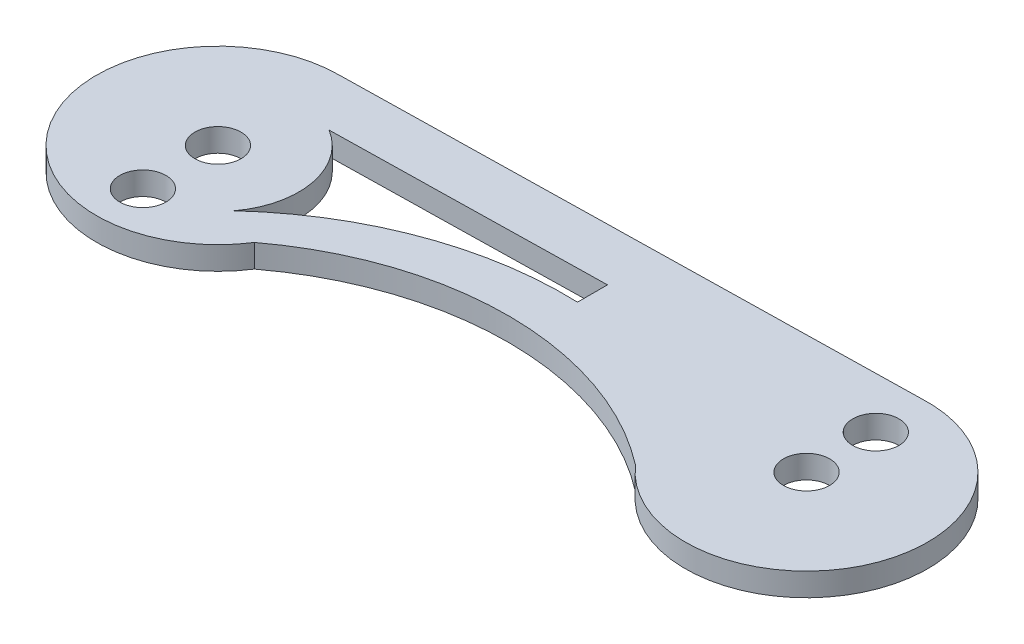
ISO-10303-21;
HEADER;
FILE_DESCRIPTION(('STEP AP214'),'2;1');
FILE_NAME('part.step','',(''),(''),'','','');
FILE_SCHEMA(('AUTOMOTIVE_DESIGN { 1 0 10303 214 1 1 1 1 }'));
ENDSEC;
DATA;
#1=APPLICATION_CONTEXT('core data for automotive mechanical design processes');
#2=APPLICATION_PROTOCOL_DEFINITION('international standard','automotive_design',2000,#1);
#3=PRODUCT_CONTEXT('',#1,'mechanical');
#4=PRODUCT('Part','Part','',(#3));
#5=PRODUCT_RELATED_PRODUCT_CATEGORY('part','',(#4));
#6=PRODUCT_DEFINITION_FORMATION('','',#4);
#7=PRODUCT_DEFINITION_CONTEXT('part definition',#1,'design');
#8=PRODUCT_DEFINITION('design','',#6,#7);
#9=PRODUCT_DEFINITION_SHAPE('','',#8);
#10=(LENGTH_UNIT() NAMED_UNIT(*) SI_UNIT(.MILLI.,.METRE.));
#11=(NAMED_UNIT(*) PLANE_ANGLE_UNIT() SI_UNIT($,.RADIAN.));
#12=(NAMED_UNIT(*) SI_UNIT($,.STERADIAN.) SOLID_ANGLE_UNIT());
#13=UNCERTAINTY_MEASURE_WITH_UNIT(LENGTH_MEASURE(1.E-05),#10,'distance_accuracy_value','');
#14=(GEOMETRIC_REPRESENTATION_CONTEXT(3) GLOBAL_UNCERTAINTY_ASSIGNED_CONTEXT((#13)) GLOBAL_UNIT_ASSIGNED_CONTEXT((#10,
#11,#12)) REPRESENTATION_CONTEXT('',''));
#15=CARTESIAN_POINT('',(0.,0.,0.));
#16=DIRECTION('',(0.,0.,1.));
#17=DIRECTION('',(1.,0.,0.));
#18=AXIS2_PLACEMENT_3D('',#15,#16,#17);
#19=CARTESIAN_POINT('',(-0.192940643459913,2.,-10.1919315878304));
#20=DIRECTION('',(-0.0189273327430687,0.,-0.999820861992404));
#21=DIRECTION('',(-0.999820861992404,0.,0.0189273327430687));
#22=AXIS2_PLACEMENT_3D('',#19,#20,#21);
#23=PLANE('',#22);
#24=DIRECTION('',(0.999820861992404,0.,-0.0189273327430687));
#25=VECTOR('',#24,1.);
#26=CARTESIAN_POINT('',(-0.192940643459913,0.,-10.1919315878304));
#27=LINE('',#26,#25);
#28=CARTESIAN_POINT('',(-33.6615259975206,0.,-9.55834703732032));
#29=VERTEX_POINT('',#28);
#30=CARTESIAN_POINT('',(15.74683894533,0.,-10.4936831551332));
#31=VERTEX_POINT('',#30);
#32=EDGE_CURVE('E150',#29,#31,#27,.T.);
#33=ORIENTED_EDGE('',*,*,#32,.F.);
#34=DIRECTION('',(0.,-1.,0.));
#35=VECTOR('',#34,1.);
#36=CARTESIAN_POINT('',(-33.6615259975206,2.,-9.55834703732032));
#37=LINE('',#36,#35);
#38=CARTESIAN_POINT('',(-33.6615259975206,2.,-9.55834703732032));
#39=VERTEX_POINT('',#38);
#40=EDGE_CURVE('E11',#39,#29,#37,.T.);
#41=ORIENTED_EDGE('',*,*,#40,.F.);
#42=DIRECTION('',(0.999820861992404,0.,-0.0189273327430687));
#43=VECTOR('',#42,1.);
#44=CARTESIAN_POINT('',(-0.192940643459913,2.,-10.1919315878304));
#45=LINE('',#44,#43);
#46=CARTESIAN_POINT('',(15.74683894533,2.,-10.4936831551332));
#47=VERTEX_POINT('',#46);
#48=EDGE_CURVE('E122',#39,#47,#45,.T.);
#49=ORIENTED_EDGE('',*,*,#48,.T.);
#50=DIRECTION('',(0.,-1.,0.));
#51=VECTOR('',#50,1.);
#52=CARTESIAN_POINT('',(15.74683894533,2.,-10.4936831551332));
#53=LINE('',#52,#51);
#54=EDGE_CURVE('E88',#47,#31,#53,.T.);
#55=ORIENTED_EDGE('',*,*,#54,.T.);
#56=EDGE_LOOP('',(#33,#41,#49,#55));
#57=FACE_BOUND('',#56,.T.);
#58=ADVANCED_FACE('F35',(#57),#23,.T.);
#59=CARTESIAN_POINT('',(-33.6615259975206,2.,0.972605925310557));
#60=DIRECTION('',(0.,-1.,0.));
#61=DIRECTION('',(0.,0.,-1.));
#62=AXIS2_PLACEMENT_3D('',#59,#60,#61);
#63=CYLINDRICAL_SURFACE('',#62,10.5309529626309);
#64=CARTESIAN_POINT('',(-33.6615259975206,0.,0.972605925310557));
#65=DIRECTION('',(0.,1.,0.));
#66=DIRECTION('',(0.,0.,1.));
#67=AXIS2_PLACEMENT_3D('',#64,#65,#66);
#68=CIRCLE('',#67,10.5309529626309);
#69=CARTESIAN_POINT('',(-24.804581512259,0.,6.66957921699252));
#70=VERTEX_POINT('',#69);
#71=EDGE_CURVE('E127',#29,#70,#68,.T.);
#72=ORIENTED_EDGE('',*,*,#71,.T.);
#73=DIRECTION('',(0.,-1.,0.));
#74=VECTOR('',#73,1.);
#75=CARTESIAN_POINT('',(-24.804581512259,2.,6.66957921699252));
#76=LINE('',#75,#74);
#77=CARTESIAN_POINT('',(-24.804581512259,2.,6.66957921699252));
#78=VERTEX_POINT('',#77);
#79=EDGE_CURVE('E45',#78,#70,#76,.T.);
#80=ORIENTED_EDGE('',*,*,#79,.F.);
#81=CARTESIAN_POINT('',(-33.6615259975206,2.,0.972605925310557));
#82=DIRECTION('',(0.,1.,0.));
#83=DIRECTION('',(0.,0.,1.));
#84=AXIS2_PLACEMENT_3D('',#81,#82,#83);
#85=CIRCLE('',#84,10.5309529626309);
#86=EDGE_CURVE('E118',#39,#78,#85,.T.);
#87=ORIENTED_EDGE('',*,*,#86,.F.);
#88=ORIENTED_EDGE('',*,*,#40,.T.);
#89=EDGE_LOOP('',(#72,#80,#87,#88));
#90=FACE_BOUND('',#89,.T.);
#91=ADVANCED_FACE('F125',(#90),#63,.T.);
#92=CARTESIAN_POINT('',(-8.33544669817756,2.,28.5449293068003));
#93=DIRECTION('',(0.,-1.,0.));
#94=DIRECTION('',(0.,0.,-1.));
#95=AXIS2_PLACEMENT_3D('',#92,#93,#94);
#96=CYLINDRICAL_SURFACE('',#95,27.3818067898385);
#97=CARTESIAN_POINT('',(-8.33544669817756,0.,28.5449293068003));
#98=DIRECTION('',(0.,1.,0.));
#99=DIRECTION('',(0.,0.,1.));
#100=AXIS2_PLACEMENT_3D('',#97,#98,#99);
#101=CIRCLE('',#100,27.3818067898385);
#102=CARTESIAN_POINT('',(8.39704073387953,0.,6.87035416881678));
#103=VERTEX_POINT('',#102);
#104=EDGE_CURVE('E147',#70,#103,#101,.F.);
#105=ORIENTED_EDGE('',*,*,#104,.T.);
#106=DIRECTION('',(0.,-1.,0.));
#107=VECTOR('',#106,1.);
#108=CARTESIAN_POINT('',(8.39704073387953,2.,6.87035416881678));
#109=LINE('',#108,#107);
#110=CARTESIAN_POINT('',(8.39704073387953,2.,6.87035416881678));
#111=VERTEX_POINT('',#110);
#112=EDGE_CURVE('E117',#111,#103,#109,.T.);
#113=ORIENTED_EDGE('',*,*,#112,.F.);
#114=CARTESIAN_POINT('',(-8.33544669817756,2.,28.5449293068003));
#115=DIRECTION('',(0.,1.,0.));
#116=DIRECTION('',(0.,0.,1.));
#117=AXIS2_PLACEMENT_3D('',#114,#115,#116);
#118=CIRCLE('',#117,27.3818067898385);
#119=EDGE_CURVE('E111',#78,#111,#118,.F.);
#120=ORIENTED_EDGE('',*,*,#119,.F.);
#121=ORIENTED_EDGE('',*,*,#79,.T.);
#122=EDGE_LOOP('',(#105,#113,#120,#121));
#123=FACE_BOUND('',#122,.T.);
#124=ADVANCED_FACE('F114',(#123),#96,.F.);
#125=CARTESIAN_POINT('',(-7.4528444847596,2.,27.580703128786));
#126=DIRECTION('',(0.,-1.,0.));
#127=DIRECTION('',(0.,0.,-1.));
#128=AXIS2_PLACEMENT_3D('',#125,#126,#127);
#129=CYLINDRICAL_SURFACE('',#128,30.4422558900555);
#130=CARTESIAN_POINT('',(-7.4528444847596,0.,27.580703128786));
#131=DIRECTION('',(0.,1.,0.));
#132=DIRECTION('',(0.,0.,1.));
#133=AXIS2_PLACEMENT_3D('',#130,#131,#132);
#134=CIRCLE('',#133,30.4422558900555);
#135=CARTESIAN_POINT('',(-28.0674734680496,0.,5.18052421081929));
#136=VERTEX_POINT('',#135);
#137=CARTESIAN_POINT('',(-6.33735393308298,0.,-2.84110852839083));
#138=VERTEX_POINT('',#137);
#139=EDGE_CURVE('E159',#136,#138,#134,.F.);
#140=ORIENTED_EDGE('',*,*,#139,.F.);
#141=DIRECTION('',(0.,-1.,0.));
#142=VECTOR('',#141,1.);
#143=CARTESIAN_POINT('',(-28.0674734680496,2.,5.18052421081929));
#144=LINE('',#143,#142);
#145=CARTESIAN_POINT('',(-28.0674734680496,2.,5.18052421081929));
#146=VERTEX_POINT('',#145);
#147=EDGE_CURVE('E39',#146,#136,#144,.T.);
#148=ORIENTED_EDGE('',*,*,#147,.F.);
#149=CARTESIAN_POINT('',(-7.4528444847596,2.,27.580703128786));
#150=DIRECTION('',(0.,1.,0.));
#151=DIRECTION('',(0.,0.,1.));
#152=AXIS2_PLACEMENT_3D('',#149,#150,#151);
#153=CIRCLE('',#152,30.4422558900555);
#154=CARTESIAN_POINT('',(-6.33735393308298,2.,-2.84110852839083));
#155=VERTEX_POINT('',#154);
#156=EDGE_CURVE('E184',#146,#155,#153,.F.);
#157=ORIENTED_EDGE('',*,*,#156,.T.);
#158=DIRECTION('',(0.,-1.,0.));
#159=VECTOR('',#158,1.);
#160=CARTESIAN_POINT('',(-6.33735393308298,2.,-2.84110852839083));
#161=LINE('',#160,#159);
#162=EDGE_CURVE('E132',#155,#138,#161,.T.);
#163=ORIENTED_EDGE('',*,*,#162,.T.);
#164=EDGE_LOOP('',(#140,#148,#157,#163));
#165=FACE_BOUND('',#164,.T.);
#166=ADVANCED_FACE('F213',(#165),#129,.T.);
#167=CARTESIAN_POINT('',(-33.6615259975206,2.,0.972605925310557));
#168=DIRECTION('',(0.,-1.,0.));
#169=DIRECTION('',(0.,0.,-1.));
#170=AXIS2_PLACEMENT_3D('',#167,#168,#169);
#171=CYLINDRICAL_SURFACE('',#170,7.);
#172=CARTESIAN_POINT('',(-33.6615259975206,0.,0.972605925310557));
#173=DIRECTION('',(0.,1.,0.));
#174=DIRECTION('',(0.,0.,1.));
#175=AXIS2_PLACEMENT_3D('',#172,#173,#174);
#176=CIRCLE('',#175,7.);
#177=CARTESIAN_POINT('',(-29.9961066090659,0.,-4.99100880962498));
#178=VERTEX_POINT('',#177);
#179=EDGE_CURVE('E157',#136,#178,#176,.T.);
#180=ORIENTED_EDGE('',*,*,#179,.T.);
#181=DIRECTION('',(0.,-1.,0.));
#182=VECTOR('',#181,1.);
#183=CARTESIAN_POINT('',(-29.9961066090659,2.,-4.99100880962498));
#184=LINE('',#183,#182);
#185=CARTESIAN_POINT('',(-29.9961066090659,2.,-4.99100880962498));
#186=VERTEX_POINT('',#185);
#187=EDGE_CURVE('E136',#186,#178,#184,.T.);
#188=ORIENTED_EDGE('',*,*,#187,.F.);
#189=CARTESIAN_POINT('',(-33.6615259975206,2.,0.972605925310557));
#190=DIRECTION('',(0.,1.,0.));
#191=DIRECTION('',(0.,0.,1.));
#192=AXIS2_PLACEMENT_3D('',#189,#190,#191);
#193=CIRCLE('',#192,7.);
#194=EDGE_CURVE('E181',#146,#186,#193,.T.);
#195=ORIENTED_EDGE('',*,*,#194,.F.);
#196=ORIENTED_EDGE('',*,*,#147,.T.);
#197=EDGE_LOOP('',(#180,#188,#195,#196));
#198=FACE_BOUND('',#197,.T.);
#199=ADVANCED_FACE('F218',(#198),#171,.T.);
#200=CARTESIAN_POINT('',(-0.105195484884904,2.,-5.55686539688747));
#201=DIRECTION('',(-0.0189273327430687,0.,-0.999820861992404));
#202=DIRECTION('',(-0.999820861992404,0.,0.0189273327430687));
#203=AXIS2_PLACEMENT_3D('',#200,#201,#202);
#204=PLANE('',#203);
#205=DIRECTION('',(0.999820861992404,0.,-0.0189273327430687));
#206=VECTOR('',#205,1.);
#207=CARTESIAN_POINT('',(-0.105195484884904,0.,-5.55686539688747));
#208=LINE('',#207,#206);
#209=CARTESIAN_POINT('',(-6.33735393308298,0.,-5.43888612565932));
#210=VERTEX_POINT('',#209);
#211=EDGE_CURVE('E155',#178,#210,#208,.T.);
#212=ORIENTED_EDGE('',*,*,#211,.T.);
#213=DIRECTION('',(0.,-1.,0.));
#214=VECTOR('',#213,1.);
#215=CARTESIAN_POINT('',(-6.33735393308298,2.,-5.43888612565932));
#216=LINE('',#215,#214);
#217=CARTESIAN_POINT('',(-6.33735393308298,2.,-5.43888612565932));
#218=VERTEX_POINT('',#217);
#219=EDGE_CURVE('E134',#218,#210,#216,.T.);
#220=ORIENTED_EDGE('',*,*,#219,.F.);
#221=DIRECTION('',(0.999820861992404,0.,-0.0189273327430687));
#222=VECTOR('',#221,1.);
#223=CARTESIAN_POINT('',(-0.105195484884904,2.,-5.55686539688747));
#224=LINE('',#223,#222);
#225=EDGE_CURVE('E178',#186,#218,#224,.T.);
#226=ORIENTED_EDGE('',*,*,#225,.F.);
#227=ORIENTED_EDGE('',*,*,#187,.T.);
#228=EDGE_LOOP('',(#212,#220,#226,#227));
#229=FACE_BOUND('',#228,.T.);
#230=ADVANCED_FACE('F220',(#229),#204,.F.);
#231=CARTESIAN_POINT('',(-6.33735393308298,2.,0.));
#232=DIRECTION('',(1.,0.,0.));
#233=DIRECTION('',(0.,0.,-1.));
#234=AXIS2_PLACEMENT_3D('',#231,#232,#233);
#235=PLANE('',#234);
#236=DIRECTION('',(0.,0.,1.));
#237=VECTOR('',#236,1.);
#238=CARTESIAN_POINT('',(-6.33735393308298,0.,0.));
#239=LINE('',#238,#237);
#240=EDGE_CURVE('E152',#210,#138,#239,.T.);
#241=ORIENTED_EDGE('',*,*,#240,.T.);
#242=ORIENTED_EDGE('',*,*,#162,.F.);
#243=DIRECTION('',(0.,0.,1.));
#244=VECTOR('',#243,1.);
#245=CARTESIAN_POINT('',(-6.33735393308298,2.,0.));
#246=LINE('',#245,#244);
#247=EDGE_CURVE('E176',#218,#155,#246,.T.);
#248=ORIENTED_EDGE('',*,*,#247,.F.);
#249=ORIENTED_EDGE('',*,*,#219,.T.);
#250=EDGE_LOOP('',(#241,#242,#248,#249));
#251=FACE_BOUND('',#250,.T.);
#252=ADVANCED_FACE('F215',(#251),#235,.F.);
#253=CARTESIAN_POINT('',(-33.6615259975206,2.,0.972605925310557));
#254=DIRECTION('',(0.,-1.,0.));
#255=DIRECTION('',(0.,0.,-1.));
#256=AXIS2_PLACEMENT_3D('',#253,#254,#255);
#257=CYLINDRICAL_SURFACE('',#256,2.);
#258=CARTESIAN_POINT('',(-33.6615259975206,2.,0.972605925310557));
#259=DIRECTION('',(0.,1.,0.));
#260=DIRECTION('',(0.,0.,1.));
#261=AXIS2_PLACEMENT_3D('',#258,#259,#260);
#262=CIRCLE('',#261,2.);
#263=CARTESIAN_POINT('',(-33.6615259975206,2.,2.97260592531056));
#264=VERTEX_POINT('',#263);
#265=EDGE_CURVE('E186',#264,#264,#262,.T.);
#266=ORIENTED_EDGE('',*,*,#265,.T.);
#267=EDGE_LOOP('',(#266));
#268=FACE_BOUND('',#267,.T.);
#269=CARTESIAN_POINT('',(-33.6615259975206,0.,0.972605925310557));
#270=DIRECTION('',(0.,1.,0.));
#271=DIRECTION('',(0.,0.,1.));
#272=AXIS2_PLACEMENT_3D('',#269,#270,#271);
#273=CIRCLE('',#272,2.);
#274=CARTESIAN_POINT('',(-33.6615259975206,0.,2.97260592531056));
#275=VERTEX_POINT('',#274);
#276=EDGE_CURVE('E162',#275,#275,#273,.T.);
#277=ORIENTED_EDGE('',*,*,#276,.F.);
#278=EDGE_LOOP('',(#277));
#279=FACE_BOUND('',#278,.T.);
#280=ADVANCED_FACE('F237',(#268,#279),#257,.F.);
#281=CARTESIAN_POINT('',(-33.6615259975206,2.,7.47260592531056));
#282=DIRECTION('',(0.,-1.,0.));
#283=DIRECTION('',(0.,0.,-1.));
#284=AXIS2_PLACEMENT_3D('',#281,#282,#283);
#285=CYLINDRICAL_SURFACE('',#284,2.);
#286=CARTESIAN_POINT('',(-33.6615259975206,2.,7.47260592531056));
#287=DIRECTION('',(0.,1.,0.));
#288=DIRECTION('',(0.,0.,1.));
#289=AXIS2_PLACEMENT_3D('',#286,#287,#288);
#290=CIRCLE('',#289,2.);
#291=CARTESIAN_POINT('',(-33.6615259975206,2.,9.47260592531056));
#292=VERTEX_POINT('',#291);
#293=EDGE_CURVE('E189',#292,#292,#290,.T.);
#294=ORIENTED_EDGE('',*,*,#293,.T.);
#295=EDGE_LOOP('',(#294));
#296=FACE_BOUND('',#295,.T.);
#297=CARTESIAN_POINT('',(-33.6615259975206,0.,7.47260592531056));
#298=DIRECTION('',(0.,1.,0.));
#299=DIRECTION('',(0.,0.,1.));
#300=AXIS2_PLACEMENT_3D('',#297,#298,#299);
#301=CIRCLE('',#300,2.);
#302=CARTESIAN_POINT('',(-33.6615259975206,0.,9.47260592531056));
#303=VERTEX_POINT('',#302);
#304=EDGE_CURVE('E165',#303,#303,#301,.T.);
#305=ORIENTED_EDGE('',*,*,#304,.F.);
#306=EDGE_LOOP('',(#305));
#307=FACE_BOUND('',#306,.T.);
#308=ADVANCED_FACE('F241',(#296,#307),#285,.F.);
#309=CARTESIAN_POINT('',(16.3288213792273,2.,-0.00982430227586414));
#310=DIRECTION('',(0.,-1.,0.));
#311=DIRECTION('',(0.,0.,-1.));
#312=AXIS2_PLACEMENT_3D('',#309,#310,#311);
#313=CYLINDRICAL_SURFACE('',#312,2.);
#314=CARTESIAN_POINT('',(16.3288213792273,2.,-0.00982430227586414));
#315=DIRECTION('',(0.,1.,0.));
#316=DIRECTION('',(0.,0.,1.));
#317=AXIS2_PLACEMENT_3D('',#314,#315,#316);
#318=CIRCLE('',#317,2.);
#319=CARTESIAN_POINT('',(16.3288213792273,2.,1.99017569772414));
#320=VERTEX_POINT('',#319);
#321=EDGE_CURVE('E192',#320,#320,#318,.T.);
#322=ORIENTED_EDGE('',*,*,#321,.T.);
#323=EDGE_LOOP('',(#322));
#324=FACE_BOUND('',#323,.T.);
#325=CARTESIAN_POINT('',(16.3288213792273,0.,-0.00982430227586414));
#326=DIRECTION('',(0.,1.,0.));
#327=DIRECTION('',(0.,0.,1.));
#328=AXIS2_PLACEMENT_3D('',#325,#326,#327);
#329=CIRCLE('',#328,2.);
#330=CARTESIAN_POINT('',(16.3288213792273,0.,1.99017569772414));
#331=VERTEX_POINT('',#330);
#332=EDGE_CURVE('E168',#331,#331,#329,.T.);
#333=ORIENTED_EDGE('',*,*,#332,.F.);
#334=EDGE_LOOP('',(#333));
#335=FACE_BOUND('',#334,.T.);
#336=ADVANCED_FACE('F247',(#324,#335),#313,.F.);
#337=CARTESIAN_POINT('',(16.3288213792273,2.,-6.00982430227586));
#338=DIRECTION('',(0.,-1.,0.));
#339=DIRECTION('',(0.,0.,-1.));
#340=AXIS2_PLACEMENT_3D('',#337,#338,#339);
#341=CYLINDRICAL_SURFACE('',#340,2.);
#342=CARTESIAN_POINT('',(16.3288213792273,2.,-6.00982430227586));
#343=DIRECTION('',(0.,1.,0.));
#344=DIRECTION('',(0.,0.,1.));
#345=AXIS2_PLACEMENT_3D('',#342,#343,#344);
#346=CIRCLE('',#345,2.);
#347=CARTESIAN_POINT('',(16.3288213792273,2.,-4.00982430227586));
#348=VERTEX_POINT('',#347);
#349=EDGE_CURVE('E146',#348,#348,#346,.T.);
#350=ORIENTED_EDGE('',*,*,#349,.T.);
#351=EDGE_LOOP('',(#350));
#352=FACE_BOUND('',#351,.T.);
#353=CARTESIAN_POINT('',(16.3288213792273,0.,-6.00982430227586));
#354=DIRECTION('',(0.,1.,0.));
#355=DIRECTION('',(0.,0.,1.));
#356=AXIS2_PLACEMENT_3D('',#353,#354,#355);
#357=CIRCLE('',#356,2.);
#358=CARTESIAN_POINT('',(16.3288213792273,0.,-4.00982430227586));
#359=VERTEX_POINT('',#358);
#360=EDGE_CURVE('E171',#359,#359,#357,.T.);
#361=ORIENTED_EDGE('',*,*,#360,.F.);
#362=EDGE_LOOP('',(#361));
#363=FACE_BOUND('',#362,.T.);
#364=ADVANCED_FACE('F37',(#352,#363),#341,.F.);
#365=CARTESIAN_POINT('',(16.3288213792273,2.,-0.00982430227586414));
#366=DIRECTION('',(0.,-1.,0.));
#367=DIRECTION('',(0.,0.,-1.));
#368=AXIS2_PLACEMENT_3D('',#365,#366,#367);
#369=CYLINDRICAL_SURFACE('',#368,10.5);
#370=CARTESIAN_POINT('',(16.3288213792273,0.,-0.00982430227586414));
#371=DIRECTION('',(0.,1.,0.));
#372=DIRECTION('',(0.,0.,1.));
#373=AXIS2_PLACEMENT_3D('',#370,#371,#372);
#374=CIRCLE('',#373,10.5);
#375=EDGE_CURVE('E81',#103,#31,#374,.T.);
#376=ORIENTED_EDGE('',*,*,#375,.T.);
#377=ORIENTED_EDGE('',*,*,#54,.F.);
#378=CARTESIAN_POINT('',(16.3288213792273,2.,-0.00982430227586414));
#379=DIRECTION('',(0.,1.,0.));
#380=DIRECTION('',(0.,0.,1.));
#381=AXIS2_PLACEMENT_3D('',#378,#379,#380);
#382=CIRCLE('',#381,10.5);
#383=EDGE_CURVE('E54',#111,#47,#382,.T.);
#384=ORIENTED_EDGE('',*,*,#383,.F.);
#385=ORIENTED_EDGE('',*,*,#112,.T.);
#386=EDGE_LOOP('',(#376,#377,#384,#385));
#387=FACE_BOUND('',#386,.T.);
#388=ADVANCED_FACE('F203',(#387),#369,.T.);
#389=CARTESIAN_POINT('',(0.,2.,0.));
#390=DIRECTION('',(0.,1.,0.));
#391=DIRECTION('',(0.,0.,1.));
#392=AXIS2_PLACEMENT_3D('',#389,#390,#391);
#393=PLANE('',#392);
#394=ORIENTED_EDGE('',*,*,#349,.F.);
#395=EDGE_LOOP('',(#394));
#396=FACE_BOUND('',#395,.T.);
#397=ORIENTED_EDGE('',*,*,#321,.F.);
#398=EDGE_LOOP('',(#397));
#399=FACE_BOUND('',#398,.T.);
#400=ORIENTED_EDGE('',*,*,#293,.F.);
#401=EDGE_LOOP('',(#400));
#402=FACE_BOUND('',#401,.T.);
#403=ORIENTED_EDGE('',*,*,#265,.F.);
#404=EDGE_LOOP('',(#403));
#405=FACE_BOUND('',#404,.T.);
#406=ORIENTED_EDGE('',*,*,#156,.F.);
#407=ORIENTED_EDGE('',*,*,#194,.T.);
#408=ORIENTED_EDGE('',*,*,#225,.T.);
#409=ORIENTED_EDGE('',*,*,#247,.T.);
#410=EDGE_LOOP('',(#406,#407,#408,#409));
#411=FACE_BOUND('',#410,.T.);
#412=ORIENTED_EDGE('',*,*,#48,.F.);
#413=ORIENTED_EDGE('',*,*,#86,.T.);
#414=ORIENTED_EDGE('',*,*,#119,.T.);
#415=ORIENTED_EDGE('',*,*,#383,.T.);
#416=EDGE_LOOP('',(#412,#413,#414,#415));
#417=FACE_BOUND('',#416,.T.);
#418=ADVANCED_FACE('F121',(#396,#399,#402,#405,#411,#417),#393,.T.);
#419=CARTESIAN_POINT('',(0.,0.,0.));
#420=DIRECTION('',(0.,1.,0.));
#421=DIRECTION('',(0.,0.,1.));
#422=AXIS2_PLACEMENT_3D('',#419,#420,#421);
#423=PLANE('',#422);
#424=ORIENTED_EDGE('',*,*,#360,.T.);
#425=EDGE_LOOP('',(#424));
#426=FACE_BOUND('',#425,.T.);
#427=ORIENTED_EDGE('',*,*,#332,.T.);
#428=EDGE_LOOP('',(#427));
#429=FACE_BOUND('',#428,.T.);
#430=ORIENTED_EDGE('',*,*,#304,.T.);
#431=EDGE_LOOP('',(#430));
#432=FACE_BOUND('',#431,.T.);
#433=ORIENTED_EDGE('',*,*,#276,.T.);
#434=EDGE_LOOP('',(#433));
#435=FACE_BOUND('',#434,.T.);
#436=ORIENTED_EDGE('',*,*,#139,.T.);
#437=ORIENTED_EDGE('',*,*,#240,.F.);
#438=ORIENTED_EDGE('',*,*,#211,.F.);
#439=ORIENTED_EDGE('',*,*,#179,.F.);
#440=EDGE_LOOP('',(#436,#437,#438,#439));
#441=FACE_BOUND('',#440,.T.);
#442=ORIENTED_EDGE('',*,*,#32,.T.);
#443=ORIENTED_EDGE('',*,*,#375,.F.);
#444=ORIENTED_EDGE('',*,*,#104,.F.);
#445=ORIENTED_EDGE('',*,*,#71,.F.);
#446=EDGE_LOOP('',(#442,#443,#444,#445));
#447=FACE_BOUND('',#446,.T.);
#448=ADVANCED_FACE('F202',(#426,#429,#432,#435,#441,#447),#423,.F.);
#449=CLOSED_SHELL('',(#58,#91,#124,#166,#199,#230,#252,#280,#308,#336,#364,#388,#418,#448));
#450=MANIFOLD_SOLID_BREP('B2',#449);
#451=ADVANCED_BREP_SHAPE_REPRESENTATION('',(#18,#450),#14);
#452=SHAPE_DEFINITION_REPRESENTATION(#9,#451);
ENDSEC;
END-ISO-10303-21;
